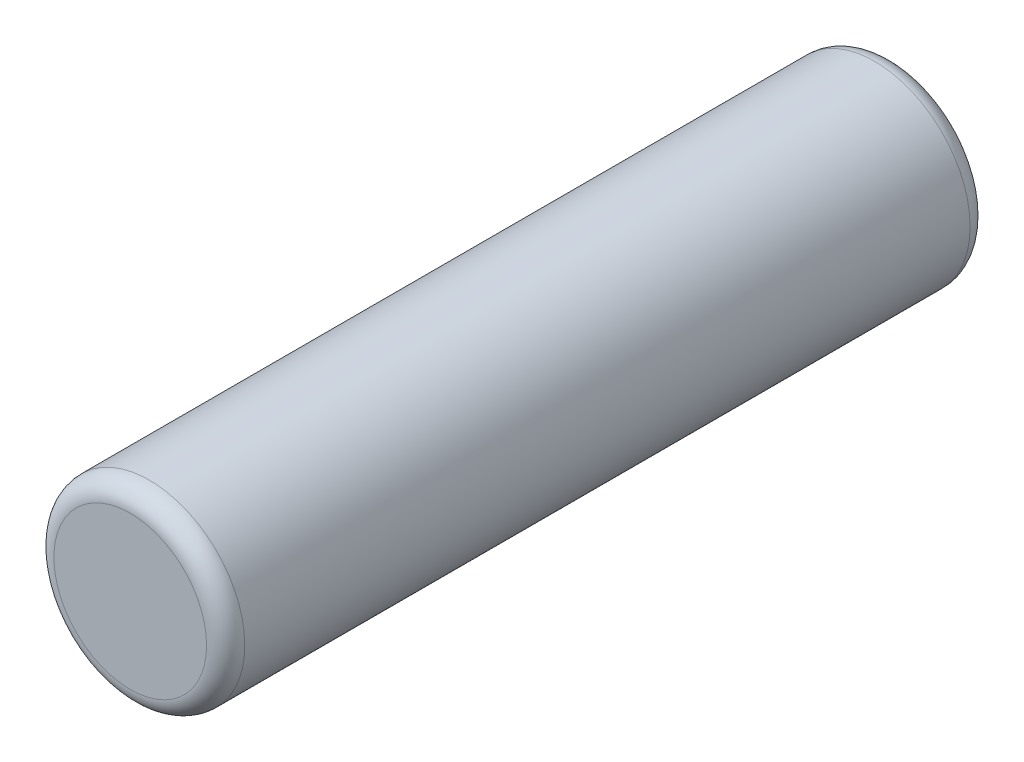
ISO-10303-21;
HEADER;
FILE_DESCRIPTION(('STEP AP214'),'2;1');
FILE_NAME('part.step','',(''),(''),'','','');
FILE_SCHEMA(('AUTOMOTIVE_DESIGN { 1 0 10303 214 1 1 1 1 }'));
ENDSEC;
DATA;
#1=APPLICATION_CONTEXT('core data for automotive mechanical design processes');
#2=APPLICATION_PROTOCOL_DEFINITION('international standard','automotive_design',2000,#1);
#3=PRODUCT_CONTEXT('',#1,'mechanical');
#4=PRODUCT('Part','Part','',(#3));
#5=PRODUCT_RELATED_PRODUCT_CATEGORY('part','',(#4));
#6=PRODUCT_DEFINITION_FORMATION('','',#4);
#7=PRODUCT_DEFINITION_CONTEXT('part definition',#1,'design');
#8=PRODUCT_DEFINITION('design','',#6,#7);
#9=PRODUCT_DEFINITION_SHAPE('','',#8);
#10=(LENGTH_UNIT() NAMED_UNIT(*) SI_UNIT(.MILLI.,.METRE.));
#11=(NAMED_UNIT(*) PLANE_ANGLE_UNIT() SI_UNIT($,.RADIAN.));
#12=(NAMED_UNIT(*) SI_UNIT($,.STERADIAN.) SOLID_ANGLE_UNIT());
#13=UNCERTAINTY_MEASURE_WITH_UNIT(LENGTH_MEASURE(1.E-05),#10,'distance_accuracy_value','');
#14=(GEOMETRIC_REPRESENTATION_CONTEXT(3) GLOBAL_UNCERTAINTY_ASSIGNED_CONTEXT((#13)) GLOBAL_UNIT_ASSIGNED_CONTEXT((#10,
#11,#12)) REPRESENTATION_CONTEXT('',''));
#15=CARTESIAN_POINT('',(0.,0.,0.));
#16=DIRECTION('',(0.,0.,1.));
#17=DIRECTION('',(1.,0.,0.));
#18=AXIS2_PLACEMENT_3D('',#15,#16,#17);
#19=CARTESIAN_POINT('',(0.,0.,20.));
#20=DIRECTION('',(0.,0.,-1.));
#21=DIRECTION('',(-1.,0.,0.));
#22=AXIS2_PLACEMENT_3D('',#19,#20,#21);
#23=CYLINDRICAL_SURFACE('',#22,2.5);
#24=CARTESIAN_POINT('',(0.,0.,0.5));
#25=DIRECTION('',(0.,0.,1.));
#26=DIRECTION('',(1.,0.,0.));
#27=AXIS2_PLACEMENT_3D('',#24,#25,#26);
#28=CIRCLE('',#27,2.5);
#29=CARTESIAN_POINT('',(2.5,0.,0.5));
#30=VERTEX_POINT('',#29);
#31=EDGE_CURVE('E46',#30,#30,#28,.T.);
#32=ORIENTED_EDGE('',*,*,#31,.T.);
#33=EDGE_LOOP('',(#32));
#34=FACE_BOUND('',#33,.T.);
#35=CARTESIAN_POINT('',(0.,0.,19.5));
#36=DIRECTION('',(0.,0.,1.));
#37=DIRECTION('',(1.,0.,0.));
#38=AXIS2_PLACEMENT_3D('',#35,#36,#37);
#39=CIRCLE('',#38,2.5);
#40=CARTESIAN_POINT('',(2.5,0.,19.5));
#41=VERTEX_POINT('',#40);
#42=EDGE_CURVE('E50',#41,#41,#39,.F.);
#43=ORIENTED_EDGE('',*,*,#42,.T.);
#44=EDGE_LOOP('',(#43));
#45=FACE_BOUND('',#44,.T.);
#46=ADVANCED_FACE('F35',(#34,#45),#23,.T.);
#47=CARTESIAN_POINT('',(0.,0.,20.));
#48=DIRECTION('',(0.,0.,1.));
#49=DIRECTION('',(1.,0.,0.));
#50=AXIS2_PLACEMENT_3D('',#47,#48,#49);
#51=PLANE('',#50);
#52=CARTESIAN_POINT('',(0.,0.,20.));
#53=DIRECTION('',(0.,0.,1.));
#54=DIRECTION('',(1.,0.,0.));
#55=AXIS2_PLACEMENT_3D('',#52,#53,#54);
#56=CIRCLE('',#55,2.);
#57=CARTESIAN_POINT('',(2.,0.,20.));
#58=VERTEX_POINT('',#57);
#59=EDGE_CURVE('E10',#58,#58,#56,.T.);
#60=ORIENTED_EDGE('',*,*,#59,.T.);
#61=EDGE_LOOP('',(#60));
#62=FACE_BOUND('',#61,.T.);
#63=ADVANCED_FACE('F66',(#62),#51,.T.);
#64=CARTESIAN_POINT('',(0.,0.,0.));
#65=DIRECTION('',(0.,0.,1.));
#66=DIRECTION('',(1.,0.,0.));
#67=AXIS2_PLACEMENT_3D('',#64,#65,#66);
#68=PLANE('',#67);
#69=CARTESIAN_POINT('',(0.,0.,0.));
#70=DIRECTION('',(0.,0.,1.));
#71=DIRECTION('',(1.,0.,0.));
#72=AXIS2_PLACEMENT_3D('',#69,#70,#71);
#73=CIRCLE('',#72,2.);
#74=CARTESIAN_POINT('',(2.,0.,0.));
#75=VERTEX_POINT('',#74);
#76=EDGE_CURVE('E42',#75,#75,#73,.F.);
#77=ORIENTED_EDGE('',*,*,#76,.T.);
#78=EDGE_LOOP('',(#77));
#79=FACE_BOUND('',#78,.T.);
#80=ADVANCED_FACE('F63',(#79),#68,.F.);
#81=CARTESIAN_POINT('',(0.,0.,0.5));
#82=DIRECTION('',(0.,0.,1.));
#83=DIRECTION('',(1.,0.,0.));
#84=AXIS2_PLACEMENT_3D('',#81,#82,#83);
#85=TOROIDAL_SURFACE('',#84,2.,0.5);
#86=ORIENTED_EDGE('',*,*,#76,.F.);
#87=EDGE_LOOP('',(#86));
#88=FACE_BOUND('',#87,.T.);
#89=ORIENTED_EDGE('',*,*,#31,.F.);
#90=EDGE_LOOP('',(#89));
#91=FACE_BOUND('',#90,.T.);
#92=ADVANCED_FACE('F59',(#88,#91),#85,.T.);
#93=CARTESIAN_POINT('',(0.,0.,19.5));
#94=DIRECTION('',(0.,0.,1.));
#95=DIRECTION('',(1.,0.,0.));
#96=AXIS2_PLACEMENT_3D('',#93,#94,#95);
#97=TOROIDAL_SURFACE('',#96,2.,0.5);
#98=ORIENTED_EDGE('',*,*,#42,.F.);
#99=EDGE_LOOP('',(#98));
#100=FACE_BOUND('',#99,.T.);
#101=ORIENTED_EDGE('',*,*,#59,.F.);
#102=EDGE_LOOP('',(#101));
#103=FACE_BOUND('',#102,.T.);
#104=ADVANCED_FACE('F37',(#100,#103),#97,.T.);
#105=CLOSED_SHELL('',(#46,#63,#80,#92,#104));
#106=MANIFOLD_SOLID_BREP('B2',#105);
#107=ADVANCED_BREP_SHAPE_REPRESENTATION('',(#18,#106),#14);
#108=SHAPE_DEFINITION_REPRESENTATION(#9,#107);
ENDSEC;
END-ISO-10303-21;
